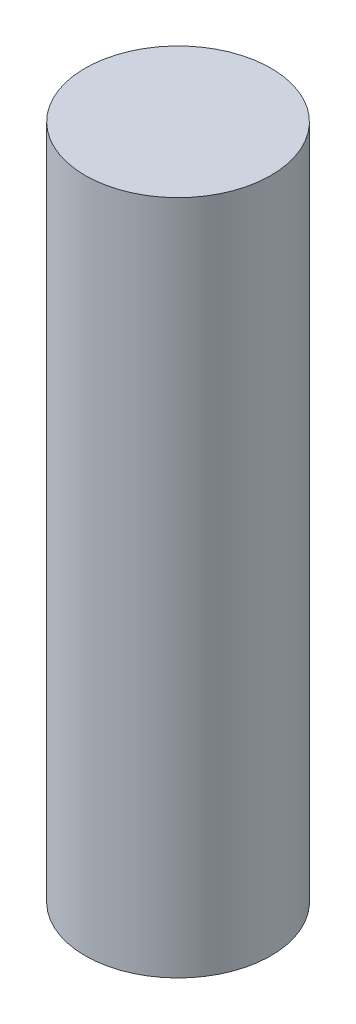
ISO-10303-21;
HEADER;
FILE_DESCRIPTION(('STEP AP214'),'2;1');
FILE_NAME('part.step','',(''),(''),'','','');
FILE_SCHEMA(('AUTOMOTIVE_DESIGN { 1 0 10303 214 1 1 1 1 }'));
ENDSEC;
DATA;
#1=APPLICATION_CONTEXT('core data for automotive mechanical design processes');
#2=APPLICATION_PROTOCOL_DEFINITION('international standard','automotive_design',2000,#1);
#3=PRODUCT_CONTEXT('',#1,'mechanical');
#4=PRODUCT('Part','Part','',(#3));
#5=PRODUCT_RELATED_PRODUCT_CATEGORY('part','',(#4));
#6=PRODUCT_DEFINITION_FORMATION('','',#4);
#7=PRODUCT_DEFINITION_CONTEXT('part definition',#1,'design');
#8=PRODUCT_DEFINITION('design','',#6,#7);
#9=PRODUCT_DEFINITION_SHAPE('','',#8);
#10=(LENGTH_UNIT() NAMED_UNIT(*) SI_UNIT(.MILLI.,.METRE.));
#11=(NAMED_UNIT(*) PLANE_ANGLE_UNIT() SI_UNIT($,.RADIAN.));
#12=(NAMED_UNIT(*) SI_UNIT($,.STERADIAN.) SOLID_ANGLE_UNIT());
#13=UNCERTAINTY_MEASURE_WITH_UNIT(LENGTH_MEASURE(1.E-05),#10,'distance_accuracy_value','');
#14=(GEOMETRIC_REPRESENTATION_CONTEXT(3) GLOBAL_UNCERTAINTY_ASSIGNED_CONTEXT((#13)) GLOBAL_UNIT_ASSIGNED_CONTEXT((#10,
#11,#12)) REPRESENTATION_CONTEXT('',''));
#15=CARTESIAN_POINT('',(0.,0.,0.));
#16=DIRECTION('',(0.,0.,1.));
#17=DIRECTION('',(1.,0.,0.));
#18=AXIS2_PLACEMENT_3D('',#15,#16,#17);
#19=CARTESIAN_POINT('',(0.,200.,0.));
#20=DIRECTION('',(0.,-1.,0.));
#21=DIRECTION('',(0.,0.,-1.));
#22=AXIS2_PLACEMENT_3D('',#19,#20,#21);
#23=CYLINDRICAL_SURFACE('',#22,27.5);
#24=CARTESIAN_POINT('',(0.,200.,0.));
#25=DIRECTION('',(0.,1.,0.));
#26=DIRECTION('',(0.,0.,1.));
#27=AXIS2_PLACEMENT_3D('',#24,#25,#26);
#28=CIRCLE('',#27,27.5);
#29=CARTESIAN_POINT('',(0.,200.,27.5));
#30=VERTEX_POINT('',#29);
#31=EDGE_CURVE('E10',#30,#30,#28,.T.);
#32=ORIENTED_EDGE('',*,*,#31,.F.);
#33=EDGE_LOOP('',(#32));
#34=FACE_BOUND('',#33,.T.);
#35=CARTESIAN_POINT('',(0.,0.,0.));
#36=DIRECTION('',(0.,1.,0.));
#37=DIRECTION('',(0.,0.,1.));
#38=AXIS2_PLACEMENT_3D('',#35,#36,#37);
#39=CIRCLE('',#38,27.5);
#40=CARTESIAN_POINT('',(0.,0.,27.5));
#41=VERTEX_POINT('',#40);
#42=EDGE_CURVE('E40',#41,#41,#39,.T.);
#43=ORIENTED_EDGE('',*,*,#42,.T.);
#44=EDGE_LOOP('',(#43));
#45=FACE_BOUND('',#44,.T.);
#46=ADVANCED_FACE('F37',(#34,#45),#23,.T.);
#47=CARTESIAN_POINT('',(0.,200.,0.));
#48=DIRECTION('',(0.,1.,0.));
#49=DIRECTION('',(0.,0.,1.));
#50=AXIS2_PLACEMENT_3D('',#47,#48,#49);
#51=PLANE('',#50);
#52=ORIENTED_EDGE('',*,*,#31,.T.);
#53=EDGE_LOOP('',(#52));
#54=FACE_BOUND('',#53,.T.);
#55=ADVANCED_FACE('F54',(#54),#51,.T.);
#56=CARTESIAN_POINT('',(0.,0.,0.));
#57=DIRECTION('',(0.,1.,0.));
#58=DIRECTION('',(0.,0.,1.));
#59=AXIS2_PLACEMENT_3D('',#56,#57,#58);
#60=PLANE('',#59);
#61=ORIENTED_EDGE('',*,*,#42,.F.);
#62=EDGE_LOOP('',(#61));
#63=FACE_BOUND('',#62,.T.);
#64=ADVANCED_FACE('F52',(#63),#60,.F.);
#65=CLOSED_SHELL('',(#46,#55,#64));
#66=MANIFOLD_SOLID_BREP('B2',#65);
#67=ADVANCED_BREP_SHAPE_REPRESENTATION('',(#18,#66),#14);
#68=SHAPE_DEFINITION_REPRESENTATION(#9,#67);
ENDSEC;
END-ISO-10303-21;
